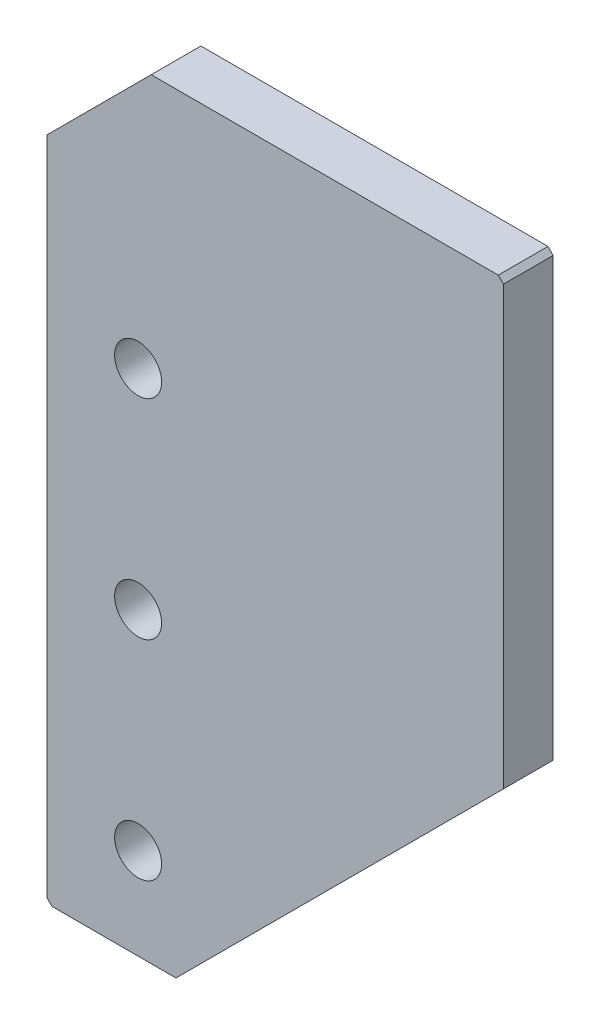
ISO-10303-21;
HEADER;
FILE_DESCRIPTION(('STEP AP214'),'2;1');
FILE_NAME('part.step','',(''),(''),'','','');
FILE_SCHEMA(('AUTOMOTIVE_DESIGN { 1 0 10303 214 1 1 1 1 }'));
ENDSEC;
DATA;
#1=APPLICATION_CONTEXT('core data for automotive mechanical design processes');
#2=APPLICATION_PROTOCOL_DEFINITION('international standard','automotive_design',2000,#1);
#3=PRODUCT_CONTEXT('',#1,'mechanical');
#4=PRODUCT('Part','Part','',(#3));
#5=PRODUCT_RELATED_PRODUCT_CATEGORY('part','',(#4));
#6=PRODUCT_DEFINITION_FORMATION('','',#4);
#7=PRODUCT_DEFINITION_CONTEXT('part definition',#1,'design');
#8=PRODUCT_DEFINITION('design','',#6,#7);
#9=PRODUCT_DEFINITION_SHAPE('','',#8);
#10=(LENGTH_UNIT() NAMED_UNIT(*) SI_UNIT(.MILLI.,.METRE.));
#11=(NAMED_UNIT(*) PLANE_ANGLE_UNIT() SI_UNIT($,.RADIAN.));
#12=(NAMED_UNIT(*) SI_UNIT($,.STERADIAN.) SOLID_ANGLE_UNIT());
#13=UNCERTAINTY_MEASURE_WITH_UNIT(LENGTH_MEASURE(1.E-05),#10,'distance_accuracy_value','');
#14=(GEOMETRIC_REPRESENTATION_CONTEXT(3) GLOBAL_UNCERTAINTY_ASSIGNED_CONTEXT((#13)) GLOBAL_UNIT_ASSIGNED_CONTEXT((#10,
#11,#12)) REPRESENTATION_CONTEXT('',''));
#15=CARTESIAN_POINT('',(0.,0.,0.));
#16=DIRECTION('',(0.,0.,1.));
#17=DIRECTION('',(1.,0.,0.));
#18=AXIS2_PLACEMENT_3D('',#15,#16,#17);
#19=CARTESIAN_POINT('',(-72.5,90.,4.7625));
#20=DIRECTION('',(1.,0.,0.));
#21=DIRECTION('',(0.,0.,-1.));
#22=AXIS2_PLACEMENT_3D('',#19,#20,#21);
#23=PLANE('',#22);
#24=DIRECTION('',(0.,-1.,0.));
#25=VECTOR('',#24,1.);
#26=CARTESIAN_POINT('',(-72.5,90.,-4.7625));
#27=LINE('',#26,#25);
#28=CARTESIAN_POINT('',(-72.5,90.,-4.7625));
#29=VERTEX_POINT('',#28);
#30=CARTESIAN_POINT('',(-72.5,-36.5,-4.7625));
#31=VERTEX_POINT('',#30);
#32=EDGE_CURVE('E146',#29,#31,#27,.T.);
#33=ORIENTED_EDGE('',*,*,#32,.T.);
#34=DIRECTION('',(0.,0.,1.));
#35=VECTOR('',#34,1.);
#36=CARTESIAN_POINT('',(-72.5,-36.5,4.7625));
#37=LINE('',#36,#35);
#38=CARTESIAN_POINT('',(-72.5,-36.5,4.7625));
#39=VERTEX_POINT('',#38);
#40=EDGE_CURVE('E11',#31,#39,#37,.T.);
#41=ORIENTED_EDGE('',*,*,#40,.T.);
#42=DIRECTION('',(0.,-1.,0.));
#43=VECTOR('',#42,1.);
#44=CARTESIAN_POINT('',(-72.5,90.,4.7625));
#45=LINE('',#44,#43);
#46=CARTESIAN_POINT('',(-72.5,90.,4.7625));
#47=VERTEX_POINT('',#46);
#48=EDGE_CURVE('E116',#47,#39,#45,.T.);
#49=ORIENTED_EDGE('',*,*,#48,.F.);
#50=DIRECTION('',(0.,0.,-1.));
#51=VECTOR('',#50,1.);
#52=CARTESIAN_POINT('',(-72.5,90.,4.7625));
#53=LINE('',#52,#51);
#54=EDGE_CURVE('E145',#47,#29,#53,.T.);
#55=ORIENTED_EDGE('',*,*,#54,.T.);
#56=EDGE_LOOP('',(#33,#41,#49,#55));
#57=FACE_BOUND('',#56,.T.);
#58=ADVANCED_FACE('F41',(#57),#23,.F.);
#59=CARTESIAN_POINT('',(-72.5,-37.5,4.7625));
#60=DIRECTION('',(0.,1.,0.));
#61=DIRECTION('',(0.,0.,1.));
#62=AXIS2_PLACEMENT_3D('',#59,#60,#61);
#63=PLANE('',#62);
#64=DIRECTION('',(1.,0.,0.));
#65=VECTOR('',#64,1.);
#66=CARTESIAN_POINT('',(-72.5,-37.5,4.7625));
#67=LINE('',#66,#65);
#68=CARTESIAN_POINT('',(-71.5,-37.5,4.7625));
#69=VERTEX_POINT('',#68);
#70=CARTESIAN_POINT('',(-47.7512626584708,-37.5,4.7625));
#71=VERTEX_POINT('',#70);
#72=EDGE_CURVE('E105',#69,#71,#67,.T.);
#73=ORIENTED_EDGE('',*,*,#72,.F.);
#74=DIRECTION('',(0.,0.,-1.));
#75=VECTOR('',#74,1.);
#76=CARTESIAN_POINT('',(-71.5,-37.5,4.7625));
#77=LINE('',#76,#75);
#78=CARTESIAN_POINT('',(-71.5,-37.5,-4.7625));
#79=VERTEX_POINT('',#78);
#80=EDGE_CURVE('E51',#69,#79,#77,.T.);
#81=ORIENTED_EDGE('',*,*,#80,.T.);
#82=DIRECTION('',(1.,0.,0.));
#83=VECTOR('',#82,1.);
#84=CARTESIAN_POINT('',(-72.5,-37.5,-4.7625));
#85=LINE('',#84,#83);
#86=CARTESIAN_POINT('',(-47.7512626584708,-37.5,-4.7625));
#87=VERTEX_POINT('',#86);
#88=EDGE_CURVE('E122',#79,#87,#85,.T.);
#89=ORIENTED_EDGE('',*,*,#88,.T.);
#90=DIRECTION('',(0.,0.,-1.));
#91=VECTOR('',#90,1.);
#92=CARTESIAN_POINT('',(-47.7512626584708,-37.5,4.7625));
#93=LINE('',#92,#91);
#94=EDGE_CURVE('E119',#71,#87,#93,.T.);
#95=ORIENTED_EDGE('',*,*,#94,.F.);
#96=EDGE_LOOP('',(#73,#81,#89,#95));
#97=FACE_BOUND('',#96,.T.);
#98=ADVANCED_FACE('F120',(#97),#63,.F.);
#99=CARTESIAN_POINT('',(-47.7512626584708,-37.5,4.7625));
#100=DIRECTION('',(-0.707106781186547,0.707106781186548,0.));
#101=DIRECTION('',(-0.707106781186548,-0.707106781186547,0.));
#102=AXIS2_PLACEMENT_3D('',#99,#100,#101);
#103=PLANE('',#102);
#104=DIRECTION('',(0.707106781186548,0.707106781186547,0.));
#105=VECTOR('',#104,1.);
#106=CARTESIAN_POINT('',(-47.7512626584708,-37.5,-4.7625));
#107=LINE('',#106,#105);
#108=CARTESIAN_POINT('',(15.,25.2512626584707,-4.7625));
#109=VERTEX_POINT('',#108);
#110=EDGE_CURVE('E152',#87,#109,#107,.T.);
#111=ORIENTED_EDGE('',*,*,#110,.T.);
#112=DIRECTION('',(0.,0.,-1.));
#113=VECTOR('',#112,1.);
#114=CARTESIAN_POINT('',(15.,25.2512626584707,4.7625));
#115=LINE('',#114,#113);
#116=CARTESIAN_POINT('',(15.,25.2512626584707,4.7625));
#117=VERTEX_POINT('',#116);
#118=EDGE_CURVE('E127',#117,#109,#115,.T.);
#119=ORIENTED_EDGE('',*,*,#118,.F.);
#120=DIRECTION('',(0.707106781186548,0.707106781186547,0.));
#121=VECTOR('',#120,1.);
#122=CARTESIAN_POINT('',(-47.7512626584708,-37.5,4.7625));
#123=LINE('',#122,#121);
#124=EDGE_CURVE('E110',#71,#117,#123,.T.);
#125=ORIENTED_EDGE('',*,*,#124,.F.);
#126=ORIENTED_EDGE('',*,*,#94,.T.);
#127=EDGE_LOOP('',(#111,#119,#125,#126));
#128=FACE_BOUND('',#127,.T.);
#129=ADVANCED_FACE('F129',(#128),#103,.F.);
#130=CARTESIAN_POINT('',(15.,25.2512626584707,4.7625));
#131=DIRECTION('',(-1.,0.,0.));
#132=DIRECTION('',(0.,-1.,0.));
#133=AXIS2_PLACEMENT_3D('',#130,#131,#132);
#134=PLANE('',#133);
#135=DIRECTION('',(0.,1.,0.));
#136=VECTOR('',#135,1.);
#137=CARTESIAN_POINT('',(15.,25.2512626584707,-4.7625));
#138=LINE('',#137,#136);
#139=CARTESIAN_POINT('',(15.,109.,-4.7625));
#140=VERTEX_POINT('',#139);
#141=EDGE_CURVE('E155',#109,#140,#138,.T.);
#142=ORIENTED_EDGE('',*,*,#141,.T.);
#143=DIRECTION('',(0.,0.,1.));
#144=VECTOR('',#143,1.);
#145=CARTESIAN_POINT('',(15.,109.,4.7625));
#146=LINE('',#145,#144);
#147=CARTESIAN_POINT('',(15.,109.,4.7625));
#148=VERTEX_POINT('',#147);
#149=EDGE_CURVE('E183',#140,#148,#146,.T.);
#150=ORIENTED_EDGE('',*,*,#149,.T.);
#151=DIRECTION('',(0.,1.,0.));
#152=VECTOR('',#151,1.);
#153=CARTESIAN_POINT('',(15.,25.2512626584707,4.7625));
#154=LINE('',#153,#152);
#155=EDGE_CURVE('E133',#117,#148,#154,.T.);
#156=ORIENTED_EDGE('',*,*,#155,.F.);
#157=ORIENTED_EDGE('',*,*,#118,.T.);
#158=EDGE_LOOP('',(#142,#150,#156,#157));
#159=FACE_BOUND('',#158,.T.);
#160=ADVANCED_FACE('F198',(#159),#134,.F.);
#161=CARTESIAN_POINT('',(15.,110.,4.7625));
#162=DIRECTION('',(0.,-1.,0.));
#163=DIRECTION('',(1.,0.,0.));
#164=AXIS2_PLACEMENT_3D('',#161,#162,#163);
#165=PLANE('',#164);
#166=DIRECTION('',(-1.,0.,0.));
#167=VECTOR('',#166,1.);
#168=CARTESIAN_POINT('',(15.,110.,4.7625));
#169=LINE('',#168,#167);
#170=CARTESIAN_POINT('',(14.,110.,4.7625));
#171=VERTEX_POINT('',#170);
#172=CARTESIAN_POINT('',(-52.5,110.,4.7625));
#173=VERTEX_POINT('',#172);
#174=EDGE_CURVE('E136',#171,#173,#169,.T.);
#175=ORIENTED_EDGE('',*,*,#174,.F.);
#176=DIRECTION('',(0.,0.,-1.));
#177=VECTOR('',#176,1.);
#178=CARTESIAN_POINT('',(14.,110.,4.7625));
#179=LINE('',#178,#177);
#180=CARTESIAN_POINT('',(14.,110.,-4.7625));
#181=VERTEX_POINT('',#180);
#182=EDGE_CURVE('E126',#171,#181,#179,.T.);
#183=ORIENTED_EDGE('',*,*,#182,.T.);
#184=DIRECTION('',(-1.,0.,0.));
#185=VECTOR('',#184,1.);
#186=CARTESIAN_POINT('',(15.,110.,-4.7625));
#187=LINE('',#186,#185);
#188=CARTESIAN_POINT('',(-52.5,110.,-4.7625));
#189=VERTEX_POINT('',#188);
#190=EDGE_CURVE('E159',#181,#189,#187,.T.);
#191=ORIENTED_EDGE('',*,*,#190,.T.);
#192=DIRECTION('',(0.,0.,-1.));
#193=VECTOR('',#192,1.);
#194=CARTESIAN_POINT('',(-52.5,110.,4.7625));
#195=LINE('',#194,#193);
#196=EDGE_CURVE('E168',#173,#189,#195,.T.);
#197=ORIENTED_EDGE('',*,*,#196,.F.);
#198=EDGE_LOOP('',(#175,#183,#191,#197));
#199=FACE_BOUND('',#198,.T.);
#200=ADVANCED_FACE('F206',(#199),#165,.F.);
#201=CARTESIAN_POINT('',(-52.5,110.,4.7625));
#202=DIRECTION('',(0.707106781186546,-0.707106781186549,0.));
#203=DIRECTION('',(0.707106781186549,0.707106781186546,0.));
#204=AXIS2_PLACEMENT_3D('',#201,#202,#203);
#205=PLANE('',#204);
#206=DIRECTION('',(-0.707106781186549,-0.707106781186546,0.));
#207=VECTOR('',#206,1.);
#208=CARTESIAN_POINT('',(-52.5,110.,-4.7625));
#209=LINE('',#208,#207);
#210=EDGE_CURVE('E162',#189,#29,#209,.T.);
#211=ORIENTED_EDGE('',*,*,#210,.T.);
#212=ORIENTED_EDGE('',*,*,#54,.F.);
#213=DIRECTION('',(-0.707106781186549,-0.707106781186546,0.));
#214=VECTOR('',#213,1.);
#215=CARTESIAN_POINT('',(-52.5,110.,4.7625));
#216=LINE('',#215,#214);
#217=EDGE_CURVE('E142',#173,#47,#216,.T.);
#218=ORIENTED_EDGE('',*,*,#217,.F.);
#219=ORIENTED_EDGE('',*,*,#196,.T.);
#220=EDGE_LOOP('',(#211,#212,#218,#219));
#221=FACE_BOUND('',#220,.T.);
#222=ADVANCED_FACE('F211',(#221),#205,.F.);
#223=CARTESIAN_POINT('',(0.,0.,4.7625));
#224=DIRECTION('',(0.,0.,1.));
#225=DIRECTION('',(1.,0.,0.));
#226=AXIS2_PLACEMENT_3D('',#223,#224,#225);
#227=PLANE('',#226);
#228=CARTESIAN_POINT('',(-55.,60.,4.7625));
#229=DIRECTION('',(0.,0.,1.));
#230=DIRECTION('',(1.,0.,0.));
#231=AXIS2_PLACEMENT_3D('',#228,#229,#230);
#232=CIRCLE('',#231,4.5);
#233=CARTESIAN_POINT('',(-50.5,60.,4.7625));
#234=VERTEX_POINT('',#233);
#235=EDGE_CURVE('E234',#234,#234,#232,.T.);
#236=ORIENTED_EDGE('',*,*,#235,.F.);
#237=EDGE_LOOP('',(#236));
#238=FACE_BOUND('',#237,.T.);
#239=CARTESIAN_POINT('',(-55.,20.,4.7625));
#240=DIRECTION('',(0.,0.,1.));
#241=DIRECTION('',(1.,0.,0.));
#242=AXIS2_PLACEMENT_3D('',#239,#240,#241);
#243=CIRCLE('',#242,4.5);
#244=CARTESIAN_POINT('',(-50.5,20.,4.7625));
#245=VERTEX_POINT('',#244);
#246=EDGE_CURVE('E226',#245,#245,#243,.T.);
#247=ORIENTED_EDGE('',*,*,#246,.F.);
#248=EDGE_LOOP('',(#247));
#249=FACE_BOUND('',#248,.T.);
#250=CARTESIAN_POINT('',(-55.,-20.,4.7625));
#251=DIRECTION('',(0.,0.,1.));
#252=DIRECTION('',(1.,0.,0.));
#253=AXIS2_PLACEMENT_3D('',#250,#251,#252);
#254=CIRCLE('',#253,4.5);
#255=CARTESIAN_POINT('',(-50.5,-20.,4.7625));
#256=VERTEX_POINT('',#255);
#257=EDGE_CURVE('E218',#256,#256,#254,.T.);
#258=ORIENTED_EDGE('',*,*,#257,.F.);
#259=EDGE_LOOP('',(#258));
#260=FACE_BOUND('',#259,.T.);
#261=ORIENTED_EDGE('',*,*,#155,.T.);
#262=DIRECTION('',(0.707106781186543,-0.707106781186552,0.));
#263=VECTOR('',#262,1.);
#264=CARTESIAN_POINT('',(62.0000000000001,61.9999999999992,4.7625));
#265=LINE('',#264,#263);
#266=EDGE_CURVE('E188',#148,#171,#265,.F.);
#267=ORIENTED_EDGE('',*,*,#266,.T.);
#268=ORIENTED_EDGE('',*,*,#174,.T.);
#269=ORIENTED_EDGE('',*,*,#217,.T.);
#270=ORIENTED_EDGE('',*,*,#48,.T.);
#271=DIRECTION('',(-0.707106781186557,0.707106781186538,0.));
#272=VECTOR('',#271,1.);
#273=CARTESIAN_POINT('',(-54.499999999999,-54.5000000000005,4.7625));
#274=LINE('',#273,#272);
#275=EDGE_CURVE('E58',#39,#69,#274,.F.);
#276=ORIENTED_EDGE('',*,*,#275,.T.);
#277=ORIENTED_EDGE('',*,*,#72,.T.);
#278=ORIENTED_EDGE('',*,*,#124,.T.);
#279=EDGE_LOOP('',(#261,#267,#268,#269,#270,#276,#277,#278));
#280=FACE_BOUND('',#279,.T.);
#281=ADVANCED_FACE('F108',(#238,#249,#260,#280),#227,.T.);
#282=CARTESIAN_POINT('',(0.,0.,-4.7625));
#283=DIRECTION('',(0.,0.,1.));
#284=DIRECTION('',(1.,0.,0.));
#285=AXIS2_PLACEMENT_3D('',#282,#283,#284);
#286=PLANE('',#285);
#287=CARTESIAN_POINT('',(-55.,60.,-4.7625));
#288=DIRECTION('',(0.,0.,1.));
#289=DIRECTION('',(1.,0.,0.));
#290=AXIS2_PLACEMENT_3D('',#287,#288,#289);
#291=CIRCLE('',#290,4.5);
#292=CARTESIAN_POINT('',(-50.5,60.,-4.7625));
#293=VERTEX_POINT('',#292);
#294=EDGE_CURVE('E230',#293,#293,#291,.T.);
#295=ORIENTED_EDGE('',*,*,#294,.T.);
#296=EDGE_LOOP('',(#295));
#297=FACE_BOUND('',#296,.T.);
#298=CARTESIAN_POINT('',(-55.,20.,-4.7625));
#299=DIRECTION('',(0.,0.,1.));
#300=DIRECTION('',(1.,0.,0.));
#301=AXIS2_PLACEMENT_3D('',#298,#299,#300);
#302=CIRCLE('',#301,4.5);
#303=CARTESIAN_POINT('',(-50.5,20.,-4.7625));
#304=VERTEX_POINT('',#303);
#305=EDGE_CURVE('E222',#304,#304,#302,.T.);
#306=ORIENTED_EDGE('',*,*,#305,.T.);
#307=EDGE_LOOP('',(#306));
#308=FACE_BOUND('',#307,.T.);
#309=CARTESIAN_POINT('',(-55.,-20.,-4.7625));
#310=DIRECTION('',(0.,0.,1.));
#311=DIRECTION('',(1.,0.,0.));
#312=AXIS2_PLACEMENT_3D('',#309,#310,#311);
#313=CIRCLE('',#312,4.5);
#314=CARTESIAN_POINT('',(-50.5,-20.,-4.7625));
#315=VERTEX_POINT('',#314);
#316=EDGE_CURVE('E149',#315,#315,#313,.T.);
#317=ORIENTED_EDGE('',*,*,#316,.T.);
#318=EDGE_LOOP('',(#317));
#319=FACE_BOUND('',#318,.T.);
#320=ORIENTED_EDGE('',*,*,#190,.F.);
#321=DIRECTION('',(-0.707106781186543,0.707106781186552,0.));
#322=VECTOR('',#321,1.);
#323=CARTESIAN_POINT('',(14.,110.,-4.7625));
#324=LINE('',#323,#322);
#325=EDGE_CURVE('E180',#181,#140,#324,.F.);
#326=ORIENTED_EDGE('',*,*,#325,.T.);
#327=ORIENTED_EDGE('',*,*,#141,.F.);
#328=ORIENTED_EDGE('',*,*,#110,.F.);
#329=ORIENTED_EDGE('',*,*,#88,.F.);
#330=DIRECTION('',(0.707106781186557,-0.707106781186538,0.));
#331=VECTOR('',#330,1.);
#332=CARTESIAN_POINT('',(-71.5,-37.5,-4.7625));
#333=LINE('',#332,#331);
#334=EDGE_CURVE('E177',#79,#31,#333,.F.);
#335=ORIENTED_EDGE('',*,*,#334,.T.);
#336=ORIENTED_EDGE('',*,*,#32,.F.);
#337=ORIENTED_EDGE('',*,*,#210,.F.);
#338=EDGE_LOOP('',(#320,#326,#327,#328,#329,#335,#336,#337));
#339=FACE_BOUND('',#338,.T.);
#340=ADVANCED_FACE('F194',(#297,#308,#319,#339),#286,.F.);
#341=CARTESIAN_POINT('',(-55.,-20.,4.7625));
#342=DIRECTION('',(0.,0.,1.));
#343=DIRECTION('',(1.,0.,0.));
#344=AXIS2_PLACEMENT_3D('',#341,#342,#343);
#345=CYLINDRICAL_SURFACE('',#344,4.5);
#346=ORIENTED_EDGE('',*,*,#316,.F.);
#347=EDGE_LOOP('',(#346));
#348=FACE_BOUND('',#347,.T.);
#349=ORIENTED_EDGE('',*,*,#257,.T.);
#350=EDGE_LOOP('',(#349));
#351=FACE_BOUND('',#350,.T.);
#352=ADVANCED_FACE('F248',(#348,#351),#345,.F.);
#353=CARTESIAN_POINT('',(-55.,20.,4.7625));
#354=DIRECTION('',(0.,0.,1.));
#355=DIRECTION('',(1.,0.,0.));
#356=AXIS2_PLACEMENT_3D('',#353,#354,#355);
#357=CYLINDRICAL_SURFACE('',#356,4.5);
#358=ORIENTED_EDGE('',*,*,#305,.F.);
#359=EDGE_LOOP('',(#358));
#360=FACE_BOUND('',#359,.T.);
#361=ORIENTED_EDGE('',*,*,#246,.T.);
#362=EDGE_LOOP('',(#361));
#363=FACE_BOUND('',#362,.T.);
#364=ADVANCED_FACE('F250',(#360,#363),#357,.F.);
#365=CARTESIAN_POINT('',(-55.,60.,4.7625));
#366=DIRECTION('',(0.,0.,1.));
#367=DIRECTION('',(1.,0.,0.));
#368=AXIS2_PLACEMENT_3D('',#365,#366,#367);
#369=CYLINDRICAL_SURFACE('',#368,4.5);
#370=ORIENTED_EDGE('',*,*,#294,.F.);
#371=EDGE_LOOP('',(#370));
#372=FACE_BOUND('',#371,.T.);
#373=ORIENTED_EDGE('',*,*,#235,.T.);
#374=EDGE_LOOP('',(#373));
#375=FACE_BOUND('',#374,.T.);
#376=ADVANCED_FACE('F239',(#372,#375),#369,.F.);
#377=CARTESIAN_POINT('',(14.,110.,4.7625));
#378=DIRECTION('',(-0.707106781186552,-0.707106781186543,0.));
#379=DIRECTION('',(0.,0.,-1.));
#380=AXIS2_PLACEMENT_3D('',#377,#378,#379);
#381=PLANE('',#380);
#382=ORIENTED_EDGE('',*,*,#266,.F.);
#383=ORIENTED_EDGE('',*,*,#149,.F.);
#384=ORIENTED_EDGE('',*,*,#325,.F.);
#385=ORIENTED_EDGE('',*,*,#182,.F.);
#386=EDGE_LOOP('',(#382,#383,#384,#385));
#387=FACE_BOUND('',#386,.T.);
#388=ADVANCED_FACE('F204',(#387),#381,.F.);
#389=CARTESIAN_POINT('',(-71.5,-37.5,4.7625));
#390=DIRECTION('',(0.707106781186538,0.707106781186557,0.));
#391=DIRECTION('',(0.,0.,-1.));
#392=AXIS2_PLACEMENT_3D('',#389,#390,#391);
#393=PLANE('',#392);
#394=ORIENTED_EDGE('',*,*,#275,.F.);
#395=ORIENTED_EDGE('',*,*,#40,.F.);
#396=ORIENTED_EDGE('',*,*,#334,.F.);
#397=ORIENTED_EDGE('',*,*,#80,.F.);
#398=EDGE_LOOP('',(#394,#395,#396,#397));
#399=FACE_BOUND('',#398,.T.);
#400=ADVANCED_FACE('F44',(#399),#393,.F.);
#401=CLOSED_SHELL('',(#58,#98,#129,#160,#200,#222,#281,#340,#352,#364,#376,#388,#400));
#402=MANIFOLD_SOLID_BREP('B2',#401);
#403=ADVANCED_BREP_SHAPE_REPRESENTATION('',(#18,#402),#14);
#404=SHAPE_DEFINITION_REPRESENTATION(#9,#403);
ENDSEC;
END-ISO-10303-21;
